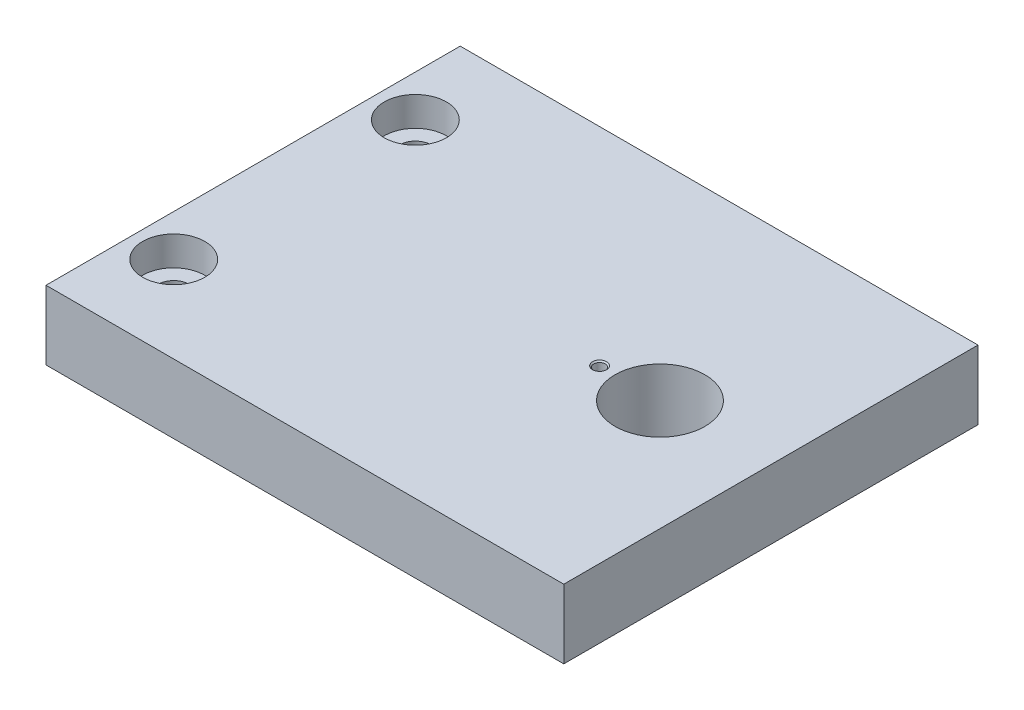
ISO-10303-21;
HEADER;
FILE_DESCRIPTION(('STEP AP214'),'2;1');
FILE_NAME('part.step','',(''),(''),'','','');
FILE_SCHEMA(('AUTOMOTIVE_DESIGN { 1 0 10303 214 1 1 1 1 }'));
ENDSEC;
DATA;
#1=APPLICATION_CONTEXT('core data for automotive mechanical design processes');
#2=APPLICATION_PROTOCOL_DEFINITION('international standard','automotive_design',2000,#1);
#3=PRODUCT_CONTEXT('',#1,'mechanical');
#4=PRODUCT('Part','Part','',(#3));
#5=PRODUCT_RELATED_PRODUCT_CATEGORY('part','',(#4));
#6=PRODUCT_DEFINITION_FORMATION('','',#4);
#7=PRODUCT_DEFINITION_CONTEXT('part definition',#1,'design');
#8=PRODUCT_DEFINITION('design','',#6,#7);
#9=PRODUCT_DEFINITION_SHAPE('','',#8);
#10=(LENGTH_UNIT() NAMED_UNIT(*) SI_UNIT(.MILLI.,.METRE.));
#11=(NAMED_UNIT(*) PLANE_ANGLE_UNIT() SI_UNIT($,.RADIAN.));
#12=(NAMED_UNIT(*) SI_UNIT($,.STERADIAN.) SOLID_ANGLE_UNIT());
#13=UNCERTAINTY_MEASURE_WITH_UNIT(LENGTH_MEASURE(1.E-05),#10,'distance_accuracy_value','');
#14=(GEOMETRIC_REPRESENTATION_CONTEXT(3) GLOBAL_UNCERTAINTY_ASSIGNED_CONTEXT((#13)) GLOBAL_UNIT_ASSIGNED_CONTEXT((#10,
#11,#12)) REPRESENTATION_CONTEXT('',''));
#15=CARTESIAN_POINT('',(0.,0.,0.));
#16=DIRECTION('',(0.,0.,1.));
#17=DIRECTION('',(1.,0.,0.));
#18=AXIS2_PLACEMENT_3D('',#15,#16,#17);
#19=CARTESIAN_POINT('',(-130.638727776725,45.9016990716547,-49.));
#20=DIRECTION('',(0.,-1.,0.));
#21=DIRECTION('',(1.,0.,0.));
#22=AXIS2_PLACEMENT_3D('',#19,#20,#21);
#23=PLANE('',#22);
#24=CARTESIAN_POINT('',(-138.499530318051,45.9016990716547,15.));
#25=DIRECTION('',(0.,-1.,0.));
#26=DIRECTION('',(0.,0.,-1.));
#27=AXIS2_PLACEMENT_3D('',#24,#25,#26);
#28=CIRCLE('',#27,2.5);
#29=CARTESIAN_POINT('',(-138.499530318051,45.9016990716547,12.5));
#30=VERTEX_POINT('',#29);
#31=EDGE_CURVE('E102',#30,#30,#28,.T.);
#32=ORIENTED_EDGE('',*,*,#31,.F.);
#33=EDGE_LOOP('',(#32));
#34=FACE_BOUND('',#33,.T.);
#35=CARTESIAN_POINT('',(-138.499530318051,45.9016990716547,-15.));
#36=DIRECTION('',(0.,-1.,0.));
#37=DIRECTION('',(0.,0.,-1.));
#38=AXIS2_PLACEMENT_3D('',#35,#36,#37);
#39=CIRCLE('',#38,2.5);
#40=CARTESIAN_POINT('',(-138.499530318051,45.9016990716547,-17.5));
#41=VERTEX_POINT('',#40);
#42=EDGE_CURVE('E101',#41,#41,#39,.T.);
#43=ORIENTED_EDGE('',*,*,#42,.F.);
#44=EDGE_LOOP('',(#43));
#45=FACE_BOUND('',#44,.T.);
#46=CARTESIAN_POINT('',(-138.499530318051,45.9016990716547,-35.));
#47=DIRECTION('',(0.,-1.,0.));
#48=DIRECTION('',(1.,0.,0.));
#49=AXIS2_PLACEMENT_3D('',#46,#47,#48);
#50=CIRCLE('',#49,4.5);
#51=CARTESIAN_POINT('',(-133.999530318051,45.9016990716547,-35.));
#52=VERTEX_POINT('',#51);
#53=EDGE_CURVE('E41',#52,#52,#50,.T.);
#54=ORIENTED_EDGE('',*,*,#53,.F.);
#55=EDGE_LOOP('',(#54));
#56=FACE_BOUND('',#55,.T.);
#57=CARTESIAN_POINT('',(-138.499530318051,45.9016990716547,35.));
#58=DIRECTION('',(0.,-1.,0.));
#59=DIRECTION('',(1.,0.,0.));
#60=AXIS2_PLACEMENT_3D('',#57,#58,#59);
#61=CIRCLE('',#60,4.5);
#62=CARTESIAN_POINT('',(-133.999530318051,45.9016990716547,35.));
#63=VERTEX_POINT('',#62);
#64=EDGE_CURVE('E130',#63,#63,#61,.T.);
#65=ORIENTED_EDGE('',*,*,#64,.F.);
#66=EDGE_LOOP('',(#65));
#67=FACE_BOUND('',#66,.T.);
#68=CARTESIAN_POINT('',(-50.1330149227674,45.9016990716547,0.));
#69=DIRECTION('',(0.,-1.,0.));
#70=DIRECTION('',(1.,0.,0.));
#71=AXIS2_PLACEMENT_3D('',#68,#69,#70);
#72=CIRCLE('',#71,1.65);
#73=CARTESIAN_POINT('',(-48.4830149227674,45.9016990716547,0.));
#74=VERTEX_POINT('',#73);
#75=EDGE_CURVE('E137',#74,#74,#72,.T.);
#76=ORIENTED_EDGE('',*,*,#75,.F.);
#77=EDGE_LOOP('',(#76));
#78=FACE_BOUND('',#77,.T.);
#79=CARTESIAN_POINT('',(-32.6330149227674,45.9016990716547,0.));
#80=DIRECTION('',(0.,-1.,0.));
#81=DIRECTION('',(0.,0.,-1.));
#82=AXIS2_PLACEMENT_3D('',#79,#80,#81);
#83=CIRCLE('',#82,13.);
#84=CARTESIAN_POINT('',(-32.6330149227674,45.9016990716547,-13.));
#85=VERTEX_POINT('',#84);
#86=EDGE_CURVE('E143',#85,#85,#83,.T.);
#87=ORIENTED_EDGE('',*,*,#86,.F.);
#88=EDGE_LOOP('',(#87));
#89=FACE_BOUND('',#88,.T.);
#90=DIRECTION('',(1.,0.,0.));
#91=VECTOR('',#90,1.);
#92=CARTESIAN_POINT('',(-0.499530318050526,45.9016990716547,60.));
#93=LINE('',#92,#91);
#94=CARTESIAN_POINT('',(-150.499530318051,45.9016990716547,60.));
#95=VERTEX_POINT('',#94);
#96=CARTESIAN_POINT('',(-0.499530318050526,45.9016990716547,60.));
#97=VERTEX_POINT('',#96);
#98=EDGE_CURVE('E73',#95,#97,#93,.T.);
#99=ORIENTED_EDGE('',*,*,#98,.F.);
#100=DIRECTION('',(0.,0.,-1.));
#101=VECTOR('',#100,1.);
#102=CARTESIAN_POINT('',(-150.499530318051,45.9016990716547,60.));
#103=LINE('',#102,#101);
#104=CARTESIAN_POINT('',(-150.499530318051,45.9016990716547,-60.));
#105=VERTEX_POINT('',#104);
#106=EDGE_CURVE('E146',#95,#105,#103,.T.);
#107=ORIENTED_EDGE('',*,*,#106,.T.);
#108=DIRECTION('',(1.,0.,0.));
#109=VECTOR('',#108,1.);
#110=CARTESIAN_POINT('',(-0.499530318050526,45.9016990716547,-60.));
#111=LINE('',#110,#109);
#112=CARTESIAN_POINT('',(-0.499530318050526,45.9016990716547,-60.));
#113=VERTEX_POINT('',#112);
#114=EDGE_CURVE('E11',#105,#113,#111,.T.);
#115=ORIENTED_EDGE('',*,*,#114,.T.);
#116=DIRECTION('',(0.,0.,-1.));
#117=VECTOR('',#116,1.);
#118=CARTESIAN_POINT('',(-0.499530318050526,45.9016990716547,60.));
#119=LINE('',#118,#117);
#120=EDGE_CURVE('E147',#97,#113,#119,.T.);
#121=ORIENTED_EDGE('',*,*,#120,.F.);
#122=EDGE_LOOP('',(#99,#107,#115,#121));
#123=FACE_BOUND('',#122,.T.);
#124=ADVANCED_FACE('F37',(#34,#45,#56,#67,#78,#89,#123),#23,.T.);
#125=CARTESIAN_POINT('',(0.,0.,60.));
#126=DIRECTION('',(0.,0.,1.));
#127=DIRECTION('',(1.,0.,0.));
#128=AXIS2_PLACEMENT_3D('',#125,#126,#127);
#129=PLANE('',#128);
#130=DIRECTION('',(0.,-1.,0.));
#131=VECTOR('',#130,1.);
#132=CARTESIAN_POINT('',(-150.499530318051,45.9016990716547,60.));
#133=LINE('',#132,#131);
#134=CARTESIAN_POINT('',(-150.49953031805,65.9016990716548,60.));
#135=VERTEX_POINT('',#134);
#136=EDGE_CURVE('E153',#135,#95,#133,.T.);
#137=ORIENTED_EDGE('',*,*,#136,.T.);
#138=ORIENTED_EDGE('',*,*,#98,.T.);
#139=DIRECTION('',(0.,1.,0.));
#140=VECTOR('',#139,1.);
#141=CARTESIAN_POINT('',(-0.499530318050528,65.9016990716547,60.));
#142=LINE('',#141,#140);
#143=CARTESIAN_POINT('',(-0.499530318050528,65.9016990716547,60.));
#144=VERTEX_POINT('',#143);
#145=EDGE_CURVE('E69',#97,#144,#142,.T.);
#146=ORIENTED_EDGE('',*,*,#145,.T.);
#147=DIRECTION('',(-1.,0.,0.));
#148=VECTOR('',#147,1.);
#149=CARTESIAN_POINT('',(-150.49953031805,65.9016990716548,60.));
#150=LINE('',#149,#148);
#151=EDGE_CURVE('E160',#144,#135,#150,.T.);
#152=ORIENTED_EDGE('',*,*,#151,.T.);
#153=EDGE_LOOP('',(#137,#138,#146,#152));
#154=FACE_BOUND('',#153,.T.);
#155=ADVANCED_FACE('F172',(#154),#129,.T.);
#156=CARTESIAN_POINT('',(0.,0.,-60.));
#157=DIRECTION('',(0.,0.,1.));
#158=DIRECTION('',(1.,0.,0.));
#159=AXIS2_PLACEMENT_3D('',#156,#157,#158);
#160=PLANE('',#159);
#161=ORIENTED_EDGE('',*,*,#114,.F.);
#162=DIRECTION('',(0.,-1.,0.));
#163=VECTOR('',#162,1.);
#164=CARTESIAN_POINT('',(-150.499530318051,45.9016990716547,-60.));
#165=LINE('',#164,#163);
#166=CARTESIAN_POINT('',(-150.49953031805,65.9016990716548,-60.));
#167=VERTEX_POINT('',#166);
#168=EDGE_CURVE('E154',#167,#105,#165,.T.);
#169=ORIENTED_EDGE('',*,*,#168,.F.);
#170=DIRECTION('',(-1.,0.,0.));
#171=VECTOR('',#170,1.);
#172=CARTESIAN_POINT('',(-150.49953031805,65.9016990716548,-60.));
#173=LINE('',#172,#171);
#174=CARTESIAN_POINT('',(-0.499530318050528,65.9016990716547,-60.));
#175=VERTEX_POINT('',#174);
#176=EDGE_CURVE('E79',#175,#167,#173,.T.);
#177=ORIENTED_EDGE('',*,*,#176,.F.);
#178=DIRECTION('',(0.,1.,0.));
#179=VECTOR('',#178,1.);
#180=CARTESIAN_POINT('',(-0.499530318050528,65.9016990716547,-60.));
#181=LINE('',#180,#179);
#182=EDGE_CURVE('E47',#113,#175,#181,.T.);
#183=ORIENTED_EDGE('',*,*,#182,.F.);
#184=EDGE_LOOP('',(#161,#169,#177,#183));
#185=FACE_BOUND('',#184,.T.);
#186=ADVANCED_FACE('F39',(#185),#160,.F.);
#187=CARTESIAN_POINT('',(-0.499530318050528,65.9016990716547,60.));
#188=DIRECTION('',(-1.,0.,0.));
#189=DIRECTION('',(0.,-1.,0.));
#190=AXIS2_PLACEMENT_3D('',#187,#188,#189);
#191=PLANE('',#190);
#192=ORIENTED_EDGE('',*,*,#182,.T.);
#193=DIRECTION('',(0.,0.,-1.));
#194=VECTOR('',#193,1.);
#195=CARTESIAN_POINT('',(-0.499530318050528,65.9016990716547,60.));
#196=LINE('',#195,#194);
#197=EDGE_CURVE('E149',#144,#175,#196,.T.);
#198=ORIENTED_EDGE('',*,*,#197,.F.);
#199=ORIENTED_EDGE('',*,*,#145,.F.);
#200=ORIENTED_EDGE('',*,*,#120,.T.);
#201=EDGE_LOOP('',(#192,#198,#199,#200));
#202=FACE_BOUND('',#201,.T.);
#203=ADVANCED_FACE('F188',(#202),#191,.F.);
#204=CARTESIAN_POINT('',(-150.49953031805,65.9016990716548,60.));
#205=DIRECTION('',(0.,-1.,0.));
#206=DIRECTION('',(1.,0.,0.));
#207=AXIS2_PLACEMENT_3D('',#204,#205,#206);
#208=PLANE('',#207);
#209=CARTESIAN_POINT('',(-138.499530318051,65.9016990716547,-35.));
#210=DIRECTION('',(0.,1.,0.));
#211=DIRECTION('',(0.,0.,1.));
#212=AXIS2_PLACEMENT_3D('',#209,#210,#211);
#213=CIRCLE('',#212,9.0055);
#214=CARTESIAN_POINT('',(-138.499530318051,65.9016990716547,-25.9945));
#215=VERTEX_POINT('',#214);
#216=EDGE_CURVE('E112',#215,#215,#213,.T.);
#217=ORIENTED_EDGE('',*,*,#216,.F.);
#218=EDGE_LOOP('',(#217));
#219=FACE_BOUND('',#218,.T.);
#220=CARTESIAN_POINT('',(-138.499530318051,65.9016990716547,35.));
#221=DIRECTION('',(0.,1.,0.));
#222=DIRECTION('',(0.,0.,1.));
#223=AXIS2_PLACEMENT_3D('',#220,#221,#222);
#224=CIRCLE('',#223,9.0055);
#225=CARTESIAN_POINT('',(-138.499530318051,65.9016990716547,44.0055));
#226=VERTEX_POINT('',#225);
#227=EDGE_CURVE('E121',#226,#226,#224,.T.);
#228=ORIENTED_EDGE('',*,*,#227,.F.);
#229=EDGE_LOOP('',(#228));
#230=FACE_BOUND('',#229,.T.);
#231=CARTESIAN_POINT('',(-50.1330149227674,65.9016990716547,0.));
#232=DIRECTION('',(0.,1.,0.));
#233=DIRECTION('',(0.,0.,1.));
#234=AXIS2_PLACEMENT_3D('',#231,#232,#233);
#235=CIRCLE('',#234,2.025);
#236=CARTESIAN_POINT('',(-50.1330149227674,65.9016990716547,2.025));
#237=VERTEX_POINT('',#236);
#238=EDGE_CURVE('E131',#237,#237,#235,.T.);
#239=ORIENTED_EDGE('',*,*,#238,.F.);
#240=EDGE_LOOP('',(#239));
#241=FACE_BOUND('',#240,.T.);
#242=CARTESIAN_POINT('',(-32.6330149227674,65.9016990716547,0.));
#243=DIRECTION('',(0.,-1.,0.));
#244=DIRECTION('',(0.,0.,-1.));
#245=AXIS2_PLACEMENT_3D('',#242,#243,#244);
#246=CIRCLE('',#245,13.);
#247=CARTESIAN_POINT('',(-32.6330149227674,65.9016990716547,-13.));
#248=VERTEX_POINT('',#247);
#249=EDGE_CURVE('E140',#248,#248,#246,.T.);
#250=ORIENTED_EDGE('',*,*,#249,.T.);
#251=EDGE_LOOP('',(#250));
#252=FACE_BOUND('',#251,.T.);
#253=ORIENTED_EDGE('',*,*,#176,.T.);
#254=DIRECTION('',(0.,0.,-1.));
#255=VECTOR('',#254,1.);
#256=CARTESIAN_POINT('',(-150.49953031805,65.9016990716548,60.));
#257=LINE('',#256,#255);
#258=EDGE_CURVE('E151',#135,#167,#257,.T.);
#259=ORIENTED_EDGE('',*,*,#258,.F.);
#260=ORIENTED_EDGE('',*,*,#151,.F.);
#261=ORIENTED_EDGE('',*,*,#197,.T.);
#262=EDGE_LOOP('',(#253,#259,#260,#261));
#263=FACE_BOUND('',#262,.T.);
#264=ADVANCED_FACE('F189',(#219,#230,#241,#252,#263),#208,.F.);
#265=CARTESIAN_POINT('',(-150.499530318051,45.9016990716547,60.));
#266=DIRECTION('',(1.,0.,0.));
#267=DIRECTION('',(0.,1.,0.));
#268=AXIS2_PLACEMENT_3D('',#265,#266,#267);
#269=PLANE('',#268);
#270=ORIENTED_EDGE('',*,*,#168,.T.);
#271=ORIENTED_EDGE('',*,*,#106,.F.);
#272=ORIENTED_EDGE('',*,*,#136,.F.);
#273=ORIENTED_EDGE('',*,*,#258,.T.);
#274=EDGE_LOOP('',(#270,#271,#272,#273));
#275=FACE_BOUND('',#274,.T.);
#276=ADVANCED_FACE('F176',(#275),#269,.F.);
#277=CARTESIAN_POINT('',(-32.6330149227674,-15.2170247671728,0.));
#278=DIRECTION('',(0.,-1.,0.));
#279=DIRECTION('',(0.,0.,-1.));
#280=AXIS2_PLACEMENT_3D('',#277,#278,#279);
#281=CYLINDRICAL_SURFACE('',#280,13.);
#282=ORIENTED_EDGE('',*,*,#249,.F.);
#283=EDGE_LOOP('',(#282));
#284=FACE_BOUND('',#283,.T.);
#285=ORIENTED_EDGE('',*,*,#86,.T.);
#286=EDGE_LOOP('',(#285));
#287=FACE_BOUND('',#286,.T.);
#288=ADVANCED_FACE('F175',(#284,#287),#281,.F.);
#289=CARTESIAN_POINT('',(-50.1330149227674,65.9016990716547,0.));
#290=DIRECTION('',(0.,1.,0.));
#291=DIRECTION('',(0.,0.,1.));
#292=AXIS2_PLACEMENT_3D('',#289,#290,#291);
#293=CYLINDRICAL_SURFACE('',#292,1.65);
#294=CARTESIAN_POINT('',(-50.1330149227674,65.5266990716547,0.));
#295=DIRECTION('',(0.,1.,0.));
#296=DIRECTION('',(0.,0.,1.));
#297=AXIS2_PLACEMENT_3D('',#294,#295,#296);
#298=CIRCLE('',#297,1.65);
#299=CARTESIAN_POINT('',(-50.1330149227674,65.5266990716547,1.65));
#300=VERTEX_POINT('',#299);
#301=EDGE_CURVE('E134',#300,#300,#298,.T.);
#302=ORIENTED_EDGE('',*,*,#301,.T.);
#303=EDGE_LOOP('',(#302));
#304=FACE_BOUND('',#303,.T.);
#305=ORIENTED_EDGE('',*,*,#75,.T.);
#306=EDGE_LOOP('',(#305));
#307=FACE_BOUND('',#306,.T.);
#308=ADVANCED_FACE('F234',(#304,#307),#293,.F.);
#309=CARTESIAN_POINT('',(-50.1330149227674,65.9016990716547,0.));
#310=DIRECTION('',(0.,1.,0.));
#311=DIRECTION('',(0.,0.,1.));
#312=AXIS2_PLACEMENT_3D('',#309,#310,#311);
#313=CONICAL_SURFACE('',#312,2.025,0.785398163397448);
#314=ORIENTED_EDGE('',*,*,#301,.F.);
#315=EDGE_LOOP('',(#314));
#316=FACE_BOUND('',#315,.T.);
#317=ORIENTED_EDGE('',*,*,#238,.T.);
#318=EDGE_LOOP('',(#317));
#319=FACE_BOUND('',#318,.T.);
#320=ADVANCED_FACE('F246',(#316,#319),#313,.F.);
#321=CARTESIAN_POINT('',(-138.499530318051,65.9016990716547,35.));
#322=DIRECTION('',(0.,1.,0.));
#323=DIRECTION('',(0.,0.,1.));
#324=AXIS2_PLACEMENT_3D('',#321,#322,#323);
#325=CYLINDRICAL_SURFACE('',#324,4.5);
#326=ORIENTED_EDGE('',*,*,#64,.T.);
#327=EDGE_LOOP('',(#326));
#328=FACE_BOUND('',#327,.T.);
#329=CARTESIAN_POINT('',(-138.499530318051,57.4016990716547,35.));
#330=DIRECTION('',(0.,1.,0.));
#331=DIRECTION('',(0.,0.,1.));
#332=AXIS2_PLACEMENT_3D('',#329,#330,#331);
#333=CIRCLE('',#332,4.5);
#334=CARTESIAN_POINT('',(-138.499530318051,57.4016990716547,39.5));
#335=VERTEX_POINT('',#334);
#336=EDGE_CURVE('E127',#335,#335,#333,.T.);
#337=ORIENTED_EDGE('',*,*,#336,.T.);
#338=EDGE_LOOP('',(#337));
#339=FACE_BOUND('',#338,.T.);
#340=ADVANCED_FACE('F167',(#328,#339),#325,.F.);
#341=CARTESIAN_POINT('',(-133.999530318051,57.4016990716547,35.));
#342=DIRECTION('',(0.,-1.,0.));
#343=DIRECTION('',(0.,0.,-1.));
#344=AXIS2_PLACEMENT_3D('',#341,#342,#343);
#345=PLANE('',#344);
#346=ORIENTED_EDGE('',*,*,#336,.F.);
#347=EDGE_LOOP('',(#346));
#348=FACE_BOUND('',#347,.T.);
#349=CARTESIAN_POINT('',(-138.499530318051,57.4016990716547,35.));
#350=DIRECTION('',(0.,1.,0.));
#351=DIRECTION('',(0.,0.,1.));
#352=AXIS2_PLACEMENT_3D('',#349,#350,#351);
#353=CIRCLE('',#352,9.0055);
#354=CARTESIAN_POINT('',(-138.499530318051,57.4016990716547,44.0055));
#355=VERTEX_POINT('',#354);
#356=EDGE_CURVE('E124',#355,#355,#353,.T.);
#357=ORIENTED_EDGE('',*,*,#356,.T.);
#358=EDGE_LOOP('',(#357));
#359=FACE_BOUND('',#358,.T.);
#360=ADVANCED_FACE('F266',(#348,#359),#345,.F.);
#361=CARTESIAN_POINT('',(-138.499530318051,65.9016990716547,35.));
#362=DIRECTION('',(0.,1.,0.));
#363=DIRECTION('',(0.,0.,1.));
#364=AXIS2_PLACEMENT_3D('',#361,#362,#363);
#365=CYLINDRICAL_SURFACE('',#364,9.0055);
#366=ORIENTED_EDGE('',*,*,#356,.F.);
#367=EDGE_LOOP('',(#366));
#368=FACE_BOUND('',#367,.T.);
#369=ORIENTED_EDGE('',*,*,#227,.T.);
#370=EDGE_LOOP('',(#369));
#371=FACE_BOUND('',#370,.T.);
#372=ADVANCED_FACE('F275',(#368,#371),#365,.F.);
#373=CARTESIAN_POINT('',(-138.499530318051,65.9016990716547,-35.));
#374=DIRECTION('',(0.,1.,0.));
#375=DIRECTION('',(0.,0.,1.));
#376=AXIS2_PLACEMENT_3D('',#373,#374,#375);
#377=CYLINDRICAL_SURFACE('',#376,4.5);
#378=ORIENTED_EDGE('',*,*,#53,.T.);
#379=EDGE_LOOP('',(#378));
#380=FACE_BOUND('',#379,.T.);
#381=CARTESIAN_POINT('',(-138.499530318051,57.4016990716547,-35.));
#382=DIRECTION('',(0.,1.,0.));
#383=DIRECTION('',(0.,0.,1.));
#384=AXIS2_PLACEMENT_3D('',#381,#382,#383);
#385=CIRCLE('',#384,4.5);
#386=CARTESIAN_POINT('',(-138.499530318051,57.4016990716547,-30.5));
#387=VERTEX_POINT('',#386);
#388=EDGE_CURVE('E118',#387,#387,#385,.T.);
#389=ORIENTED_EDGE('',*,*,#388,.T.);
#390=EDGE_LOOP('',(#389));
#391=FACE_BOUND('',#390,.T.);
#392=ADVANCED_FACE('F285',(#380,#391),#377,.F.);
#393=CARTESIAN_POINT('',(-133.999530318051,57.4016990716547,-35.));
#394=DIRECTION('',(0.,-1.,0.));
#395=DIRECTION('',(0.,0.,-1.));
#396=AXIS2_PLACEMENT_3D('',#393,#394,#395);
#397=PLANE('',#396);
#398=ORIENTED_EDGE('',*,*,#388,.F.);
#399=EDGE_LOOP('',(#398));
#400=FACE_BOUND('',#399,.T.);
#401=CARTESIAN_POINT('',(-138.499530318051,57.4016990716547,-35.));
#402=DIRECTION('',(0.,1.,0.));
#403=DIRECTION('',(0.,0.,1.));
#404=AXIS2_PLACEMENT_3D('',#401,#402,#403);
#405=CIRCLE('',#404,9.0055);
#406=CARTESIAN_POINT('',(-138.499530318051,57.4016990716547,-25.9945));
#407=VERTEX_POINT('',#406);
#408=EDGE_CURVE('E115',#407,#407,#405,.T.);
#409=ORIENTED_EDGE('',*,*,#408,.T.);
#410=EDGE_LOOP('',(#409));
#411=FACE_BOUND('',#410,.T.);
#412=ADVANCED_FACE('F295',(#400,#411),#397,.F.);
#413=CARTESIAN_POINT('',(-138.499530318051,65.9016990716547,-35.));
#414=DIRECTION('',(0.,1.,0.));
#415=DIRECTION('',(0.,0.,1.));
#416=AXIS2_PLACEMENT_3D('',#413,#414,#415);
#417=CYLINDRICAL_SURFACE('',#416,9.0055);
#418=ORIENTED_EDGE('',*,*,#408,.F.);
#419=EDGE_LOOP('',(#418));
#420=FACE_BOUND('',#419,.T.);
#421=ORIENTED_EDGE('',*,*,#216,.T.);
#422=EDGE_LOOP('',(#421));
#423=FACE_BOUND('',#422,.T.);
#424=ADVANCED_FACE('F305',(#420,#423),#417,.F.);
#425=CARTESIAN_POINT('',(-138.499530318051,53.9016990716547,-15.));
#426=DIRECTION('',(0.,-1.,0.));
#427=DIRECTION('',(0.,0.,-1.));
#428=AXIS2_PLACEMENT_3D('',#425,#426,#427);
#429=CONICAL_SURFACE('',#428,2.5,1.02974425867666);
#430=CARTESIAN_POINT('',(-138.499530318051,55.4038506192236,-15.));
#431=VERTEX_POINT('',#430);
#432=VERTEX_LOOP('',#431);
#433=FACE_BOUND('',#432,.T.);
#434=CARTESIAN_POINT('',(-138.499530318051,53.9016990716547,-15.));
#435=DIRECTION('',(0.,-1.,0.));
#436=DIRECTION('',(0.,0.,-1.));
#437=AXIS2_PLACEMENT_3D('',#434,#435,#436);
#438=CIRCLE('',#437,2.5);
#439=CARTESIAN_POINT('',(-138.499530318051,53.9016990716547,-17.5));
#440=VERTEX_POINT('',#439);
#441=EDGE_CURVE('E105',#440,#440,#438,.T.);
#442=ORIENTED_EDGE('',*,*,#441,.T.);
#443=EDGE_LOOP('',(#442));
#444=FACE_BOUND('',#443,.T.);
#445=ADVANCED_FACE('F315',(#433,#444),#429,.F.);
#446=CARTESIAN_POINT('',(-138.499530318051,45.9016990716547,-15.));
#447=DIRECTION('',(0.,-1.,0.));
#448=DIRECTION('',(0.,0.,-1.));
#449=AXIS2_PLACEMENT_3D('',#446,#447,#448);
#450=CYLINDRICAL_SURFACE('',#449,2.5);
#451=ORIENTED_EDGE('',*,*,#441,.F.);
#452=EDGE_LOOP('',(#451));
#453=FACE_BOUND('',#452,.T.);
#454=ORIENTED_EDGE('',*,*,#42,.T.);
#455=EDGE_LOOP('',(#454));
#456=FACE_BOUND('',#455,.T.);
#457=ADVANCED_FACE('F95',(#453,#456),#450,.F.);
#458=CARTESIAN_POINT('',(-138.499530318051,53.9016990716547,15.));
#459=DIRECTION('',(0.,-1.,0.));
#460=DIRECTION('',(0.,0.,-1.));
#461=AXIS2_PLACEMENT_3D('',#458,#459,#460);
#462=CONICAL_SURFACE('',#461,2.5,1.02974425867666);
#463=CARTESIAN_POINT('',(-138.499530318051,55.4038506192236,15.));
#464=VERTEX_POINT('',#463);
#465=VERTEX_LOOP('',#464);
#466=FACE_BOUND('',#465,.T.);
#467=CARTESIAN_POINT('',(-138.499530318051,53.9016990716547,15.));
#468=DIRECTION('',(0.,-1.,0.));
#469=DIRECTION('',(0.,0.,-1.));
#470=AXIS2_PLACEMENT_3D('',#467,#468,#469);
#471=CIRCLE('',#470,2.5);
#472=CARTESIAN_POINT('',(-138.499530318051,53.9016990716547,12.5));
#473=VERTEX_POINT('',#472);
#474=EDGE_CURVE('E99',#473,#473,#471,.T.);
#475=ORIENTED_EDGE('',*,*,#474,.T.);
#476=EDGE_LOOP('',(#475));
#477=FACE_BOUND('',#476,.T.);
#478=ADVANCED_FACE('F91',(#466,#477),#462,.F.);
#479=CARTESIAN_POINT('',(-138.499530318051,45.9016990716547,15.));
#480=DIRECTION('',(0.,-1.,0.));
#481=DIRECTION('',(0.,0.,-1.));
#482=AXIS2_PLACEMENT_3D('',#479,#480,#481);
#483=CYLINDRICAL_SURFACE('',#482,2.5);
#484=ORIENTED_EDGE('',*,*,#474,.F.);
#485=EDGE_LOOP('',(#484));
#486=FACE_BOUND('',#485,.T.);
#487=ORIENTED_EDGE('',*,*,#31,.T.);
#488=EDGE_LOOP('',(#487));
#489=FACE_BOUND('',#488,.T.);
#490=ADVANCED_FACE('F94',(#486,#489),#483,.F.);
#491=CLOSED_SHELL('',(#124,#155,#186,#203,#264,#276,#288,#308,#320,#340,#360,#372,#392,#412,
#424,#445,#457,#478,#490));
#492=MANIFOLD_SOLID_BREP('B2',#491);
#493=ADVANCED_BREP_SHAPE_REPRESENTATION('',(#18,#492),#14);
#494=SHAPE_DEFINITION_REPRESENTATION(#9,#493);
ENDSEC;
END-ISO-10303-21;
